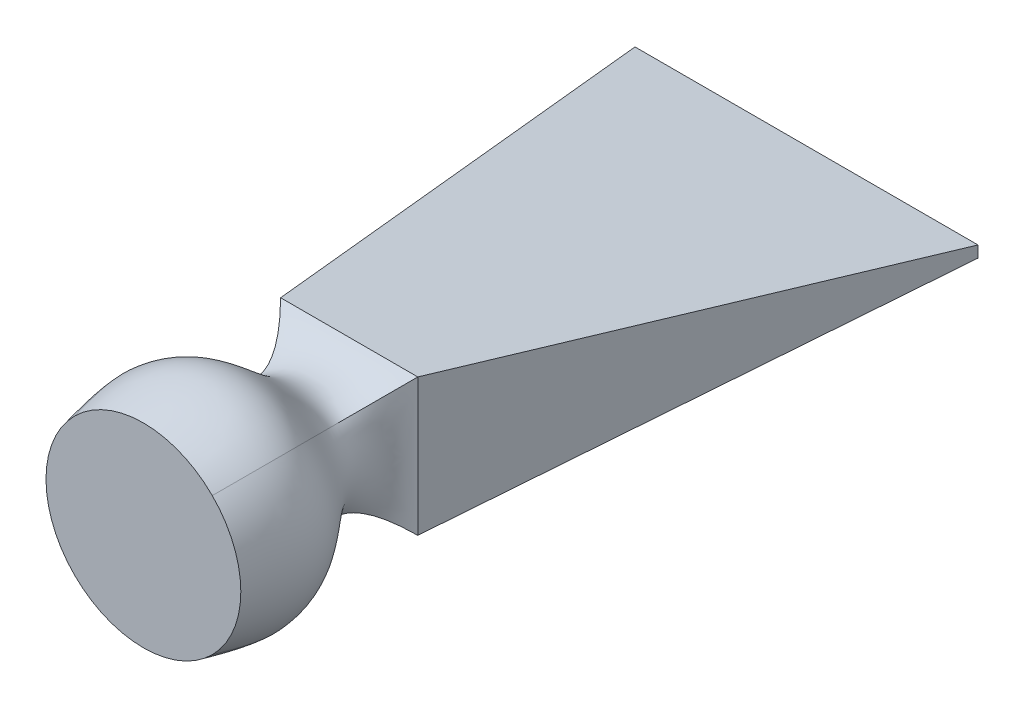
ISO-10303-21;
HEADER;
FILE_DESCRIPTION(('STEP AP214'),'2;1');
FILE_NAME('part.step','',(''),(''),'','','');
FILE_SCHEMA(('AUTOMOTIVE_DESIGN { 1 0 10303 214 1 1 1 1 }'));
ENDSEC;
DATA;
#1=APPLICATION_CONTEXT('core data for automotive mechanical design processes');
#2=APPLICATION_PROTOCOL_DEFINITION('international standard','automotive_design',2000,#1);
#3=PRODUCT_CONTEXT('',#1,'mechanical');
#4=PRODUCT('Part','Part','',(#3));
#5=PRODUCT_RELATED_PRODUCT_CATEGORY('part','',(#4));
#6=PRODUCT_DEFINITION_FORMATION('','',#4);
#7=PRODUCT_DEFINITION_CONTEXT('part definition',#1,'design');
#8=PRODUCT_DEFINITION('design','',#6,#7);
#9=PRODUCT_DEFINITION_SHAPE('','',#8);
#10=(LENGTH_UNIT() NAMED_UNIT(*) SI_UNIT(.MILLI.,.METRE.));
#11=(NAMED_UNIT(*) PLANE_ANGLE_UNIT() SI_UNIT($,.RADIAN.));
#12=(NAMED_UNIT(*) SI_UNIT($,.STERADIAN.) SOLID_ANGLE_UNIT());
#13=UNCERTAINTY_MEASURE_WITH_UNIT(LENGTH_MEASURE(1.E-05),#10,'distance_accuracy_value','');
#14=(GEOMETRIC_REPRESENTATION_CONTEXT(3) GLOBAL_UNCERTAINTY_ASSIGNED_CONTEXT((#13)) GLOBAL_UNIT_ASSIGNED_CONTEXT((#10,
#11,#12)) REPRESENTATION_CONTEXT('',''));
#15=CARTESIAN_POINT('',(0.,0.,0.));
#16=DIRECTION('',(0.,0.,1.));
#17=DIRECTION('',(1.,0.,0.));
#18=AXIS2_PLACEMENT_3D('',#15,#16,#17);
#19=CARTESIAN_POINT('',(0.,0.,90.));
#20=DIRECTION('',(0.,0.,1.));
#21=DIRECTION('',(1.,0.,0.));
#22=AXIS2_PLACEMENT_3D('',#19,#20,#21);
#23=PLANE('',#22);
#24=CARTESIAN_POINT('',(0.,0.,90.));
#25=DIRECTION('',(0.,0.,1.));
#26=DIRECTION('',(1.,0.,0.));
#27=AXIS2_PLACEMENT_3D('',#24,#25,#26);
#28=CIRCLE('',#27,42.6002659209787);
#29=CARTESIAN_POINT('',(30.1229369130742,-30.1229369130742,90.));
#30=VERTEX_POINT('',#29);
#31=CARTESIAN_POINT('',(30.1229369130742,30.1229369130742,90.));
#32=VERTEX_POINT('',#31);
#33=EDGE_CURVE('E12',#30,#32,#28,.T.);
#34=ORIENTED_EDGE('',*,*,#33,.T.);
#35=CARTESIAN_POINT('',(-30.1229369130742,30.1229369130742,90.));
#36=VERTEX_POINT('',#35);
#37=EDGE_CURVE('E88',#32,#36,#28,.T.);
#38=ORIENTED_EDGE('',*,*,#37,.T.);
#39=CARTESIAN_POINT('',(-30.1229369130742,-30.1229369130742,90.));
#40=VERTEX_POINT('',#39);
#41=EDGE_CURVE('E335',#36,#40,#28,.T.);
#42=ORIENTED_EDGE('',*,*,#41,.T.);
#43=EDGE_CURVE('E269',#40,#30,#28,.T.);
#44=ORIENTED_EDGE('',*,*,#43,.T.);
#45=EDGE_LOOP('',(#34,#38,#42,#44));
#46=FACE_BOUND('',#45,.T.);
#47=ADVANCED_FACE('F76',(#46),#23,.T.);
#48=CARTESIAN_POINT('',(30.,30.,0.));
#49=CARTESIAN_POINT('',(21.7646734436211,21.7646734436211,8.35363210140126));
#50=CARTESIAN_POINT('',(11.422558565565,11.422558565565,26.7316282837315));
#51=CARTESIAN_POINT('',(36.7436816636043,36.7436816636043,50.8905221500698));
#52=CARTESIAN_POINT('',(32.5014257713901,32.5014257713901,75.7558688263527));
#53=CARTESIAN_POINT('',(30.1229369130742,30.1229369130742,90.));
#54=CARTESIAN_POINT('',(9.99999999999999,30.,0.));
#55=CARTESIAN_POINT('',(7.25489114787371,21.7646734436211,8.35363210140126));
#56=CARTESIAN_POINT('',(6.36131004920156,23.7053905894348,26.7316282837315));
#57=CARTESIAN_POINT('',(16.0612170620096,55.0844216339168,50.8905221500698));
#58=CARTESIAN_POINT('',(14.2904655072206,49.1267267966824,75.7558688263527));
#59=CARTESIAN_POINT('',(13.4976358877819,46.7482379383665,90.));
#60=CARTESIAN_POINT('',(-10.,30.,0.));
#61=CARTESIAN_POINT('',(-7.25489114787371,21.7646734436211,8.35363210140126));
#62=CARTESIAN_POINT('',(-6.36131004920156,23.7053905894348,26.7316282837315));
#63=CARTESIAN_POINT('',(-16.0612170620096,55.0844216339167,50.8905221500698));
#64=CARTESIAN_POINT('',(-14.2904655072206,49.1267267966824,75.7558688263527));
#65=CARTESIAN_POINT('',(-13.497635887782,46.7482379383665,90.));
#66=CARTESIAN_POINT('',(-30.,30.,0.));
#67=CARTESIAN_POINT('',(-21.7646734436211,21.7646734436211,8.35363210140126));
#68=CARTESIAN_POINT('',(-11.422558565565,11.422558565565,26.7316282837315));
#69=CARTESIAN_POINT('',(-36.7436816636043,36.7436816636043,50.8905221500698));
#70=CARTESIAN_POINT('',(-32.5014257713901,32.5014257713901,75.7558688263527));
#71=CARTESIAN_POINT('',(-30.1229369130742,30.1229369130742,90.));
#72=B_SPLINE_SURFACE_WITH_KNOTS('',3,3,((#48,#49,#50,#51,#52,#53),(#54,#55,#56,#57,#58,#59),
(#60,#61,#62,#63,#64,#65),(#66,#67,#68,#69,#70,#71)),.UNSPECIFIED.,.F.,.F.,.F.,(4,4),(4,1,1,4),
(0.,1.),(0.,0.283939218522882,0.594150366625815,1.),.UNSPECIFIED.);
#73=DIRECTION('',(-1.,0.,0.));
#74=VECTOR('',#73,1.);
#75=CARTESIAN_POINT('',(-30.,30.,0.));
#76=LINE('',#75,#74);
#77=CARTESIAN_POINT('',(30.,30.,0.));
#78=VERTEX_POINT('',#77);
#79=CARTESIAN_POINT('',(-30.,30.,0.));
#80=VERTEX_POINT('',#79);
#81=EDGE_CURVE('E244',#78,#80,#76,.T.);
#82=CARTESIAN_POINT('',(-30.,30.,0.));
#83=CARTESIAN_POINT('',(-21.7646734436211,21.7646734436211,8.35363210140126));
#84=CARTESIAN_POINT('',(-11.422558565565,11.422558565565,26.7316282837315));
#85=CARTESIAN_POINT('',(-36.7436816636043,36.7436816636043,50.8905221500698));
#86=CARTESIAN_POINT('',(-32.5014257713901,32.5014257713901,75.7558688263527));
#87=CARTESIAN_POINT('',(-30.1229369130742,30.1229369130742,90.));
#88=B_SPLINE_CURVE_WITH_KNOTS('',3,(#82,#83,#84,#85,#86,#87),.UNSPECIFIED.,.F.,.F.,(4,1,1,4),
(0.,0.283939218522882,0.594150366625815,1.),.UNSPECIFIED.);
#89=EDGE_CURVE('E238',#80,#36,#88,.T.);
#90=CARTESIAN_POINT('',(30.,30.,0.));
#91=CARTESIAN_POINT('',(21.7646734436211,21.7646734436211,8.35363210140126));
#92=CARTESIAN_POINT('',(11.422558565565,11.422558565565,26.7316282837315));
#93=CARTESIAN_POINT('',(36.7436816636043,36.7436816636043,50.8905221500698));
#94=CARTESIAN_POINT('',(32.5014257713901,32.5014257713901,75.7558688263527));
#95=CARTESIAN_POINT('',(30.1229369130742,30.1229369130742,90.));
#96=B_SPLINE_CURVE_WITH_KNOTS('',3,(#90,#91,#92,#93,#94,#95),.UNSPECIFIED.,.F.,.F.,(4,1,1,4),
(0.,0.283939218522882,0.594150366625815,1.),.UNSPECIFIED.);
#97=EDGE_CURVE('E235',#32,#78,#96,.F.);
#98=ORIENTED_EDGE('',*,*,#81,.T.);
#99=ORIENTED_EDGE('',*,*,#89,.T.);
#100=ORIENTED_EDGE('',*,*,#37,.F.);
#101=ORIENTED_EDGE('',*,*,#97,.T.);
#102=EDGE_LOOP('',(#98,#99,#100,#101));
#103=FACE_BOUND('',#102,.T.);
#104=ADVANCED_FACE('F387',(#103),#72,.T.);
#105=CARTESIAN_POINT('',(-30.,30.,0.));
#106=CARTESIAN_POINT('',(-21.7646734436211,21.7646734436211,8.35363210140126));
#107=CARTESIAN_POINT('',(-11.422558565565,11.422558565565,26.7316282837315));
#108=CARTESIAN_POINT('',(-36.7436816636043,36.7436816636043,50.8905221500698));
#109=CARTESIAN_POINT('',(-32.5014257713901,32.5014257713901,75.7558688263527));
#110=CARTESIAN_POINT('',(-30.1229369130742,30.1229369130742,90.));
#111=CARTESIAN_POINT('',(-30.,9.99999999999999,0.));
#112=CARTESIAN_POINT('',(-21.7646734436211,7.25489114787371,8.35363210140126));
#113=CARTESIAN_POINT('',(-23.7053905894348,6.36131004920157,26.7316282837315));
#114=CARTESIAN_POINT('',(-55.0844216339167,16.0612170620096,50.8905221500698));
#115=CARTESIAN_POINT('',(-49.1267267966824,14.2904655072206,75.7558688263527));
#116=CARTESIAN_POINT('',(-46.7482379383665,13.4976358877819,90.));
#117=CARTESIAN_POINT('',(-30.,-10.,0.));
#118=CARTESIAN_POINT('',(-21.7646734436211,-7.25489114787371,8.35363210140126));
#119=CARTESIAN_POINT('',(-23.7053905894348,-6.36131004920155,26.7316282837315));
#120=CARTESIAN_POINT('',(-55.0844216339168,-16.0612170620096,50.8905221500698));
#121=CARTESIAN_POINT('',(-49.1267267966824,-14.2904655072206,75.7558688263527));
#122=CARTESIAN_POINT('',(-46.7482379383665,-13.4976358877819,90.));
#123=CARTESIAN_POINT('',(-30.,-30.,0.));
#124=CARTESIAN_POINT('',(-21.7646734436211,-21.7646734436211,8.35363210140126));
#125=CARTESIAN_POINT('',(-11.422558565565,-11.422558565565,26.7316282837315));
#126=CARTESIAN_POINT('',(-36.7436816636043,-36.7436816636043,50.8905221500698));
#127=CARTESIAN_POINT('',(-32.5014257713901,-32.5014257713901,75.7558688263527));
#128=CARTESIAN_POINT('',(-30.1229369130742,-30.1229369130742,90.));
#129=B_SPLINE_SURFACE_WITH_KNOTS('',3,3,((#105,#106,#107,#108,#109,#110),(#111,#112,#113,#114,
#115,#116),(#117,#118,#119,#120,#121,#122),(#123,#124,#125,#126,#127,#128)),.UNSPECIFIED.,.F.,
.F.,.F.,(4,4),(4,1,1,4),(0.,1.),(0.,0.283939218522882,0.594150366625815,1.),.UNSPECIFIED.);
#130=DIRECTION('',(0.,-1.,0.));
#131=VECTOR('',#130,1.);
#132=CARTESIAN_POINT('',(-30.,30.,0.));
#133=LINE('',#132,#131);
#134=CARTESIAN_POINT('',(-30.,-30.,0.));
#135=VERTEX_POINT('',#134);
#136=EDGE_CURVE('E373',#80,#135,#133,.T.);
#137=CARTESIAN_POINT('',(-30.,-30.,0.));
#138=CARTESIAN_POINT('',(-21.7646734436211,-21.7646734436211,8.35363210140126));
#139=CARTESIAN_POINT('',(-11.422558565565,-11.422558565565,26.7316282837315));
#140=CARTESIAN_POINT('',(-36.7436816636043,-36.7436816636043,50.8905221500698));
#141=CARTESIAN_POINT('',(-32.5014257713901,-32.5014257713901,75.7558688263527));
#142=CARTESIAN_POINT('',(-30.1229369130742,-30.1229369130742,90.));
#143=B_SPLINE_CURVE_WITH_KNOTS('',3,(#137,#138,#139,#140,#141,#142),.UNSPECIFIED.,.F.,.F.,(4,1,
1,4),(0.,0.283939218522882,0.594150366625815,1.),.UNSPECIFIED.);
#144=EDGE_CURVE('E253',#135,#40,#143,.T.);
#145=ORIENTED_EDGE('',*,*,#136,.T.);
#146=ORIENTED_EDGE('',*,*,#144,.T.);
#147=ORIENTED_EDGE('',*,*,#41,.F.);
#148=ORIENTED_EDGE('',*,*,#89,.F.);
#149=EDGE_LOOP('',(#145,#146,#147,#148));
#150=FACE_BOUND('',#149,.T.);
#151=ADVANCED_FACE('F306',(#150),#129,.T.);
#152=CARTESIAN_POINT('',(30.,-30.,0.));
#153=CARTESIAN_POINT('',(21.7646734436211,-21.7646734436211,8.35363210140126));
#154=CARTESIAN_POINT('',(11.422558565565,-11.422558565565,26.7316282837315));
#155=CARTESIAN_POINT('',(36.7436816636043,-36.7436816636043,50.8905221500698));
#156=CARTESIAN_POINT('',(32.5014257713901,-32.5014257713901,75.7558688263527));
#157=CARTESIAN_POINT('',(30.1229369130742,-30.1229369130742,90.));
#158=CARTESIAN_POINT('',(30.,-10.,0.));
#159=CARTESIAN_POINT('',(21.7646734436211,-7.25489114787371,8.35363210140126));
#160=CARTESIAN_POINT('',(23.7053905894348,-6.36131004920156,26.7316282837315));
#161=CARTESIAN_POINT('',(55.0844216339167,-16.0612170620096,50.8905221500698));
#162=CARTESIAN_POINT('',(49.1267267966824,-14.2904655072206,75.7558688263527));
#163=CARTESIAN_POINT('',(46.7482379383665,-13.497635887782,90.));
#164=CARTESIAN_POINT('',(30.,9.99999999999999,0.));
#165=CARTESIAN_POINT('',(21.7646734436211,7.25489114787371,8.35363210140126));
#166=CARTESIAN_POINT('',(23.7053905894348,6.36131004920155,26.7316282837315));
#167=CARTESIAN_POINT('',(55.0844216339168,16.0612170620096,50.8905221500698));
#168=CARTESIAN_POINT('',(49.1267267966824,14.2904655072206,75.7558688263527));
#169=CARTESIAN_POINT('',(46.7482379383665,13.4976358877819,90.));
#170=CARTESIAN_POINT('',(30.,30.,0.));
#171=CARTESIAN_POINT('',(21.7646734436211,21.7646734436211,8.35363210140126));
#172=CARTESIAN_POINT('',(11.422558565565,11.422558565565,26.7316282837315));
#173=CARTESIAN_POINT('',(36.7436816636043,36.7436816636043,50.8905221500698));
#174=CARTESIAN_POINT('',(32.5014257713901,32.5014257713901,75.7558688263527));
#175=CARTESIAN_POINT('',(30.1229369130742,30.1229369130742,90.));
#176=B_SPLINE_SURFACE_WITH_KNOTS('',3,3,((#152,#153,#154,#155,#156,#157),(#158,#159,#160,#161,
#162,#163),(#164,#165,#166,#167,#168,#169),(#170,#171,#172,#173,#174,#175)),.UNSPECIFIED.,.F.,
.F.,.F.,(4,4),(4,1,1,4),(0.,1.),(0.,0.283939218522882,0.594150366625815,1.),.UNSPECIFIED.);
#177=DIRECTION('',(0.,1.,0.));
#178=VECTOR('',#177,1.);
#179=CARTESIAN_POINT('',(30.,30.,0.));
#180=LINE('',#179,#178);
#181=CARTESIAN_POINT('',(30.,-30.,0.));
#182=VERTEX_POINT('',#181);
#183=EDGE_CURVE('E165',#182,#78,#180,.T.);
#184=CARTESIAN_POINT('',(30.,-30.,0.));
#185=CARTESIAN_POINT('',(21.7646734436211,-21.7646734436211,8.35363210140126));
#186=CARTESIAN_POINT('',(11.422558565565,-11.422558565565,26.7316282837315));
#187=CARTESIAN_POINT('',(36.7436816636043,-36.7436816636043,50.8905221500698));
#188=CARTESIAN_POINT('',(32.5014257713901,-32.5014257713901,75.7558688263527));
#189=CARTESIAN_POINT('',(30.1229369130742,-30.1229369130742,90.));
#190=B_SPLINE_CURVE_WITH_KNOTS('',3,(#184,#185,#186,#187,#188,#189),.UNSPECIFIED.,.F.,.F.,(4,1,
1,4),(0.,0.283939218522882,0.594150366625815,1.),.UNSPECIFIED.);
#191=EDGE_CURVE('E261',#182,#30,#190,.T.);
#192=ORIENTED_EDGE('',*,*,#183,.T.);
#193=ORIENTED_EDGE('',*,*,#97,.F.);
#194=ORIENTED_EDGE('',*,*,#33,.F.);
#195=ORIENTED_EDGE('',*,*,#191,.F.);
#196=EDGE_LOOP('',(#192,#193,#194,#195));
#197=FACE_BOUND('',#196,.T.);
#198=ADVANCED_FACE('F296',(#197),#176,.T.);
#199=CARTESIAN_POINT('',(-30.,-30.,0.));
#200=CARTESIAN_POINT('',(-21.7646734436211,-21.7646734436211,8.35363210140126));
#201=CARTESIAN_POINT('',(-11.422558565565,-11.422558565565,26.7316282837315));
#202=CARTESIAN_POINT('',(-36.7436816636043,-36.7436816636043,50.8905221500698));
#203=CARTESIAN_POINT('',(-32.5014257713901,-32.5014257713901,75.7558688263527));
#204=CARTESIAN_POINT('',(-30.1229369130742,-30.1229369130742,90.));
#205=CARTESIAN_POINT('',(-9.99999999999999,-30.,0.));
#206=CARTESIAN_POINT('',(-7.25489114787371,-21.7646734436211,8.35363210140126));
#207=CARTESIAN_POINT('',(-6.36131004920157,-23.7053905894348,26.7316282837315));
#208=CARTESIAN_POINT('',(-16.0612170620096,-55.0844216339167,50.8905221500698));
#209=CARTESIAN_POINT('',(-14.2904655072206,-49.1267267966824,75.7558688263527));
#210=CARTESIAN_POINT('',(-13.497635887782,-46.7482379383665,90.));
#211=CARTESIAN_POINT('',(10.,-30.,0.));
#212=CARTESIAN_POINT('',(7.25489114787372,-21.7646734436211,8.35363210140126));
#213=CARTESIAN_POINT('',(6.36131004920155,-23.7053905894348,26.7316282837315));
#214=CARTESIAN_POINT('',(16.0612170620096,-55.0844216339168,50.8905221500698));
#215=CARTESIAN_POINT('',(14.2904655072206,-49.1267267966824,75.7558688263527));
#216=CARTESIAN_POINT('',(13.4976358877819,-46.7482379383665,90.));
#217=CARTESIAN_POINT('',(30.,-30.,0.));
#218=CARTESIAN_POINT('',(21.7646734436211,-21.7646734436211,8.35363210140126));
#219=CARTESIAN_POINT('',(11.422558565565,-11.422558565565,26.7316282837315));
#220=CARTESIAN_POINT('',(36.7436816636043,-36.7436816636043,50.8905221500698));
#221=CARTESIAN_POINT('',(32.5014257713901,-32.5014257713901,75.7558688263527));
#222=CARTESIAN_POINT('',(30.1229369130742,-30.1229369130742,90.));
#223=B_SPLINE_SURFACE_WITH_KNOTS('',3,3,((#199,#200,#201,#202,#203,#204),(#205,#206,#207,#208,
#209,#210),(#211,#212,#213,#214,#215,#216),(#217,#218,#219,#220,#221,#222)),.UNSPECIFIED.,.F.,
.F.,.F.,(4,4),(4,1,1,4),(0.,1.),(0.,0.283939218522882,0.594150366625815,1.),.UNSPECIFIED.);
#224=DIRECTION('',(1.,0.,0.));
#225=VECTOR('',#224,1.);
#226=CARTESIAN_POINT('',(-30.,-30.,0.));
#227=LINE('',#226,#225);
#228=EDGE_CURVE('E368',#135,#182,#227,.T.);
#229=ORIENTED_EDGE('',*,*,#228,.T.);
#230=ORIENTED_EDGE('',*,*,#191,.T.);
#231=ORIENTED_EDGE('',*,*,#43,.F.);
#232=ORIENTED_EDGE('',*,*,#144,.F.);
#233=EDGE_LOOP('',(#229,#230,#231,#232));
#234=FACE_BOUND('',#233,.T.);
#235=ADVANCED_FACE('F288',(#234),#223,.T.);
#236=CARTESIAN_POINT('',(0.,0.,-200.));
#237=DIRECTION('',(0.,0.,-1.));
#238=DIRECTION('',(-1.,0.,0.));
#239=AXIS2_PLACEMENT_3D('',#236,#237,#238);
#240=PLANE('',#239);
#241=DIRECTION('',(0.,-1.,0.));
#242=VECTOR('',#241,1.);
#243=CARTESIAN_POINT('',(-75.,2.49999999999999,-200.));
#244=LINE('',#243,#242);
#245=CARTESIAN_POINT('',(-75.,2.49999999999999,-200.));
#246=VERTEX_POINT('',#245);
#247=CARTESIAN_POINT('',(-75.0000000000001,-2.50000000000001,-200.));
#248=VERTEX_POINT('',#247);
#249=EDGE_CURVE('E156',#246,#248,#244,.T.);
#250=ORIENTED_EDGE('',*,*,#249,.F.);
#251=DIRECTION('',(-1.,0.,0.));
#252=VECTOR('',#251,1.);
#253=CARTESIAN_POINT('',(75.,2.50000000000001,-200.));
#254=LINE('',#253,#252);
#255=CARTESIAN_POINT('',(75.,2.50000000000001,-200.));
#256=VERTEX_POINT('',#255);
#257=EDGE_CURVE('E136',#256,#246,#254,.T.);
#258=ORIENTED_EDGE('',*,*,#257,.F.);
#259=DIRECTION('',(0.,1.,0.));
#260=VECTOR('',#259,1.);
#261=CARTESIAN_POINT('',(75.,2.50000000000001,-200.));
#262=LINE('',#261,#260);
#263=CARTESIAN_POINT('',(75.,-2.49999999999999,-200.));
#264=VERTEX_POINT('',#263);
#265=EDGE_CURVE('E129',#264,#256,#262,.T.);
#266=ORIENTED_EDGE('',*,*,#265,.F.);
#267=DIRECTION('',(1.,0.,0.));
#268=VECTOR('',#267,1.);
#269=CARTESIAN_POINT('',(75.,-2.49999999999999,-200.));
#270=LINE('',#269,#268);
#271=EDGE_CURVE('E133',#248,#264,#270,.T.);
#272=ORIENTED_EDGE('',*,*,#271,.F.);
#273=EDGE_LOOP('',(#250,#258,#266,#272));
#274=FACE_BOUND('',#273,.T.);
#275=ADVANCED_FACE('F135',(#274),#240,.T.);
#276=CARTESIAN_POINT('',(0.,29.4433369115166,-4.04845882533354));
#277=DIRECTION('',(0.,0.990678839845296,-0.136218340478728));
#278=DIRECTION('',(0.,0.136218340478728,0.990678839845296));
#279=AXIS2_PLACEMENT_3D('',#276,#277,#278);
#280=PLANE('',#279);
#281=DIRECTION('',(0.217563370783763,-0.132955393256744,-0.966948314594504));
#282=VECTOR('',#281,1.);
#283=CARTESIAN_POINT('',(30.,30.,0.));
#284=LINE('',#283,#282);
#285=EDGE_CURVE('E167',#78,#256,#284,.T.);
#286=ORIENTED_EDGE('',*,*,#285,.T.);
#287=ORIENTED_EDGE('',*,*,#257,.T.);
#288=DIRECTION('',(-0.217563370783763,-0.132955393256744,-0.966948314594504));
#289=VECTOR('',#288,1.);
#290=CARTESIAN_POINT('',(-30.,30.,0.));
#291=LINE('',#290,#289);
#292=EDGE_CURVE('E162',#80,#246,#291,.T.);
#293=ORIENTED_EDGE('',*,*,#292,.F.);
#294=ORIENTED_EDGE('',*,*,#81,.F.);
#295=EDGE_LOOP('',(#286,#287,#293,#294));
#296=FACE_BOUND('',#295,.T.);
#297=ADVANCED_FACE('F182',(#296),#280,.T.);
#298=CARTESIAN_POINT('',(-28.5544318857824,0.,6.42474717430103));
#299=DIRECTION('',(-0.975609756097561,0.,0.219512195121951));
#300=DIRECTION('',(0.219512195121951,0.,0.975609756097561));
#301=AXIS2_PLACEMENT_3D('',#298,#299,#300);
#302=PLANE('',#301);
#303=ORIENTED_EDGE('',*,*,#292,.T.);
#304=ORIENTED_EDGE('',*,*,#249,.T.);
#305=DIRECTION('',(-0.217563370783764,0.132955393256744,-0.966948314594504));
#306=VECTOR('',#305,1.);
#307=CARTESIAN_POINT('',(-30.,-30.,0.));
#308=LINE('',#307,#306);
#309=EDGE_CURVE('E154',#135,#248,#308,.T.);
#310=ORIENTED_EDGE('',*,*,#309,.F.);
#311=ORIENTED_EDGE('',*,*,#136,.F.);
#312=EDGE_LOOP('',(#303,#304,#310,#311));
#313=FACE_BOUND('',#312,.T.);
#314=ADVANCED_FACE('F193',(#313),#302,.T.);
#315=CARTESIAN_POINT('',(28.5544318857823,0.,6.42474717430101));
#316=DIRECTION('',(0.975609756097561,0.,0.219512195121951));
#317=DIRECTION('',(0.219512195121951,0.,-0.975609756097561));
#318=AXIS2_PLACEMENT_3D('',#315,#316,#317);
#319=PLANE('',#318);
#320=DIRECTION('',(0.217563370783763,0.132955393256744,-0.966948314594504));
#321=VECTOR('',#320,1.);
#322=CARTESIAN_POINT('',(30.,-30.,0.));
#323=LINE('',#322,#321);
#324=EDGE_CURVE('E155',#182,#264,#323,.T.);
#325=ORIENTED_EDGE('',*,*,#324,.T.);
#326=ORIENTED_EDGE('',*,*,#265,.T.);
#327=ORIENTED_EDGE('',*,*,#285,.F.);
#328=ORIENTED_EDGE('',*,*,#183,.F.);
#329=EDGE_LOOP('',(#325,#326,#327,#328));
#330=FACE_BOUND('',#329,.T.);
#331=ADVANCED_FACE('F159',(#330),#319,.T.);
#332=CARTESIAN_POINT('',(0.,-29.4433369115166,-4.04845882533354));
#333=DIRECTION('',(0.,-0.990678839845296,-0.136218340478728));
#334=DIRECTION('',(0.,0.136218340478728,-0.990678839845296));
#335=AXIS2_PLACEMENT_3D('',#332,#333,#334);
#336=PLANE('',#335);
#337=ORIENTED_EDGE('',*,*,#309,.T.);
#338=ORIENTED_EDGE('',*,*,#271,.T.);
#339=ORIENTED_EDGE('',*,*,#324,.F.);
#340=ORIENTED_EDGE('',*,*,#228,.F.);
#341=EDGE_LOOP('',(#337,#338,#339,#340));
#342=FACE_BOUND('',#341,.T.);
#343=ADVANCED_FACE('F151',(#342),#336,.T.);
#344=CLOSED_SHELL('',(#47,#104,#151,#198,#235,#275,#297,#314,#331,#343));
#345=MANIFOLD_SOLID_BREP('B2',#344);
#346=ADVANCED_BREP_SHAPE_REPRESENTATION('',(#18,#345),#14);
#347=SHAPE_DEFINITION_REPRESENTATION(#9,#346);
ENDSEC;
END-ISO-10303-21;
